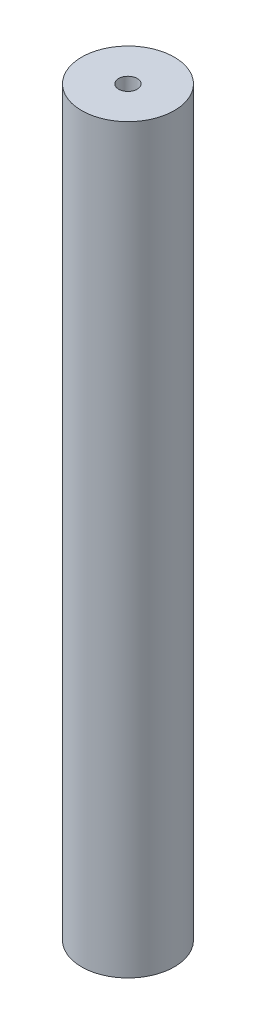
ISO-10303-21;
HEADER;
FILE_DESCRIPTION(('STEP AP214'),'2;1');
FILE_NAME('part.step','',(''),(''),'','','');
FILE_SCHEMA(('AUTOMOTIVE_DESIGN { 1 0 10303 214 1 1 1 1 }'));
ENDSEC;
DATA;
#1=APPLICATION_CONTEXT('core data for automotive mechanical design processes');
#2=APPLICATION_PROTOCOL_DEFINITION('international standard','automotive_design',2000,#1);
#3=PRODUCT_CONTEXT('',#1,'mechanical');
#4=PRODUCT('Part','Part','',(#3));
#5=PRODUCT_RELATED_PRODUCT_CATEGORY('part','',(#4));
#6=PRODUCT_DEFINITION_FORMATION('','',#4);
#7=PRODUCT_DEFINITION_CONTEXT('part definition',#1,'design');
#8=PRODUCT_DEFINITION('design','',#6,#7);
#9=PRODUCT_DEFINITION_SHAPE('','',#8);
#10=(LENGTH_UNIT() NAMED_UNIT(*) SI_UNIT(.MILLI.,.METRE.));
#11=(NAMED_UNIT(*) PLANE_ANGLE_UNIT() SI_UNIT($,.RADIAN.));
#12=(NAMED_UNIT(*) SI_UNIT($,.STERADIAN.) SOLID_ANGLE_UNIT());
#13=UNCERTAINTY_MEASURE_WITH_UNIT(LENGTH_MEASURE(1.E-05),#10,'distance_accuracy_value','');
#14=(GEOMETRIC_REPRESENTATION_CONTEXT(3) GLOBAL_UNCERTAINTY_ASSIGNED_CONTEXT((#13)) GLOBAL_UNIT_ASSIGNED_CONTEXT((#10,
#11,#12)) REPRESENTATION_CONTEXT('',''));
#15=CARTESIAN_POINT('',(0.,0.,0.));
#16=DIRECTION('',(0.,0.,1.));
#17=DIRECTION('',(1.,0.,0.));
#18=AXIS2_PLACEMENT_3D('',#15,#16,#17);
#19=CARTESIAN_POINT('',(0.,101.6,0.));
#20=DIRECTION('',(0.,-1.,0.));
#21=DIRECTION('',(0.,0.,-1.));
#22=AXIS2_PLACEMENT_3D('',#19,#20,#21);
#23=CYLINDRICAL_SURFACE('',#22,12.7);
#24=CARTESIAN_POINT('',(0.,101.6,0.));
#25=DIRECTION('',(0.,1.,0.));
#26=DIRECTION('',(0.,0.,1.));
#27=AXIS2_PLACEMENT_3D('',#24,#25,#26);
#28=CIRCLE('',#27,12.7);
#29=CARTESIAN_POINT('',(0.,101.6,12.7));
#30=VERTEX_POINT('',#29);
#31=EDGE_CURVE('E13',#30,#30,#28,.T.);
#32=ORIENTED_EDGE('',*,*,#31,.F.);
#33=EDGE_LOOP('',(#32));
#34=FACE_BOUND('',#33,.T.);
#35=CARTESIAN_POINT('',(0.,-101.6,0.));
#36=DIRECTION('',(0.,1.,0.));
#37=DIRECTION('',(0.,0.,1.));
#38=AXIS2_PLACEMENT_3D('',#35,#36,#37);
#39=CIRCLE('',#38,12.7);
#40=CARTESIAN_POINT('',(0.,-101.6,12.7));
#41=VERTEX_POINT('',#40);
#42=EDGE_CURVE('E62',#41,#41,#39,.T.);
#43=ORIENTED_EDGE('',*,*,#42,.T.);
#44=EDGE_LOOP('',(#43));
#45=FACE_BOUND('',#44,.T.);
#46=ADVANCED_FACE('F59',(#34,#45),#23,.T.);
#47=CARTESIAN_POINT('',(0.,101.6,0.));
#48=DIRECTION('',(0.,1.,0.));
#49=DIRECTION('',(0.,0.,1.));
#50=AXIS2_PLACEMENT_3D('',#47,#48,#49);
#51=PLANE('',#50);
#52=CARTESIAN_POINT('',(0.,101.6,0.));
#53=DIRECTION('',(0.,1.,0.));
#54=DIRECTION('',(0.,0.,1.));
#55=AXIS2_PLACEMENT_3D('',#52,#53,#54);
#56=CIRCLE('',#55,2.55269999999999);
#57=CARTESIAN_POINT('',(0.,101.6,2.55269999999999));
#58=VERTEX_POINT('',#57);
#59=EDGE_CURVE('E85',#58,#58,#56,.T.);
#60=ORIENTED_EDGE('',*,*,#59,.F.);
#61=EDGE_LOOP('',(#60));
#62=FACE_BOUND('',#61,.T.);
#63=ORIENTED_EDGE('',*,*,#31,.T.);
#64=EDGE_LOOP('',(#63));
#65=FACE_BOUND('',#64,.T.);
#66=ADVANCED_FACE('F110',(#62,#65),#51,.T.);
#67=CARTESIAN_POINT('',(0.,-101.6,0.));
#68=DIRECTION('',(0.,1.,0.));
#69=DIRECTION('',(0.,0.,1.));
#70=AXIS2_PLACEMENT_3D('',#67,#68,#69);
#71=PLANE('',#70);
#72=CARTESIAN_POINT('',(0.,-101.6,0.));
#73=DIRECTION('',(0.,-1.,0.));
#74=DIRECTION('',(0.,0.,-1.));
#75=AXIS2_PLACEMENT_3D('',#72,#73,#74);
#76=CIRCLE('',#75,2.55269999999999);
#77=CARTESIAN_POINT('',(0.,-101.6,-2.55269999999999));
#78=VERTEX_POINT('',#77);
#79=EDGE_CURVE('E84',#78,#78,#76,.T.);
#80=ORIENTED_EDGE('',*,*,#79,.F.);
#81=EDGE_LOOP('',(#80));
#82=FACE_BOUND('',#81,.T.);
#83=ORIENTED_EDGE('',*,*,#42,.F.);
#84=EDGE_LOOP('',(#83));
#85=FACE_BOUND('',#84,.T.);
#86=ADVANCED_FACE('F107',(#82,#85),#71,.F.);
#87=CARTESIAN_POINT('',(0.,-85.09,0.));
#88=DIRECTION('',(0.,-1.,0.));
#89=DIRECTION('',(0.,0.,-1.));
#90=AXIS2_PLACEMENT_3D('',#87,#88,#89);
#91=CONICAL_SURFACE('',#90,2.55269999999999,1.02974425867665);
#92=CARTESIAN_POINT('',(0.,-83.5561830978084,0.));
#93=VERTEX_POINT('',#92);
#94=VERTEX_LOOP('',#93);
#95=FACE_BOUND('',#94,.T.);
#96=CARTESIAN_POINT('',(0.,-85.09,0.));
#97=DIRECTION('',(0.,-1.,0.));
#98=DIRECTION('',(0.,0.,-1.));
#99=AXIS2_PLACEMENT_3D('',#96,#97,#98);
#100=CIRCLE('',#99,2.55269999999999);
#101=CARTESIAN_POINT('',(0.,-85.09,-2.55269999999999));
#102=VERTEX_POINT('',#101);
#103=EDGE_CURVE('E91',#102,#102,#100,.T.);
#104=ORIENTED_EDGE('',*,*,#103,.T.);
#105=EDGE_LOOP('',(#104));
#106=FACE_BOUND('',#105,.T.);
#107=ADVANCED_FACE('F109',(#95,#106),#91,.F.);
#108=CARTESIAN_POINT('',(0.,-101.6,0.));
#109=DIRECTION('',(0.,-1.,0.));
#110=DIRECTION('',(0.,0.,-1.));
#111=AXIS2_PLACEMENT_3D('',#108,#109,#110);
#112=CYLINDRICAL_SURFACE('',#111,2.55269999999999);
#113=ORIENTED_EDGE('',*,*,#103,.F.);
#114=EDGE_LOOP('',(#113));
#115=FACE_BOUND('',#114,.T.);
#116=ORIENTED_EDGE('',*,*,#79,.T.);
#117=EDGE_LOOP('',(#116));
#118=FACE_BOUND('',#117,.T.);
#119=ADVANCED_FACE('F77',(#115,#118),#112,.F.);
#120=CARTESIAN_POINT('',(0.,85.09,0.));
#121=DIRECTION('',(0.,1.,0.));
#122=DIRECTION('',(0.,0.,1.));
#123=AXIS2_PLACEMENT_3D('',#120,#121,#122);
#124=CONICAL_SURFACE('',#123,2.55269999999999,1.02974425867665);
#125=CARTESIAN_POINT('',(0.,83.5561830978084,0.));
#126=VERTEX_POINT('',#125);
#127=VERTEX_LOOP('',#126);
#128=FACE_BOUND('',#127,.T.);
#129=CARTESIAN_POINT('',(0.,85.09,0.));
#130=DIRECTION('',(0.,1.,0.));
#131=DIRECTION('',(0.,0.,1.));
#132=AXIS2_PLACEMENT_3D('',#129,#130,#131);
#133=CIRCLE('',#132,2.55269999999999);
#134=CARTESIAN_POINT('',(0.,85.09,2.55269999999999));
#135=VERTEX_POINT('',#134);
#136=EDGE_CURVE('E81',#135,#135,#133,.T.);
#137=ORIENTED_EDGE('',*,*,#136,.T.);
#138=EDGE_LOOP('',(#137));
#139=FACE_BOUND('',#138,.T.);
#140=ADVANCED_FACE('F73',(#128,#139),#124,.F.);
#141=CARTESIAN_POINT('',(0.,101.6,0.));
#142=DIRECTION('',(0.,1.,0.));
#143=DIRECTION('',(0.,0.,1.));
#144=AXIS2_PLACEMENT_3D('',#141,#142,#143);
#145=CYLINDRICAL_SURFACE('',#144,2.55269999999999);
#146=ORIENTED_EDGE('',*,*,#136,.F.);
#147=EDGE_LOOP('',(#146));
#148=FACE_BOUND('',#147,.T.);
#149=ORIENTED_EDGE('',*,*,#59,.T.);
#150=EDGE_LOOP('',(#149));
#151=FACE_BOUND('',#150,.T.);
#152=ADVANCED_FACE('F76',(#148,#151),#145,.F.);
#153=CLOSED_SHELL('',(#46,#66,#86,#107,#119,#140,#152));
#154=MANIFOLD_SOLID_BREP('B2',#153);
#155=ADVANCED_BREP_SHAPE_REPRESENTATION('',(#18,#154),#14);
#156=SHAPE_DEFINITION_REPRESENTATION(#9,#155);
ENDSEC;
END-ISO-10303-21;
